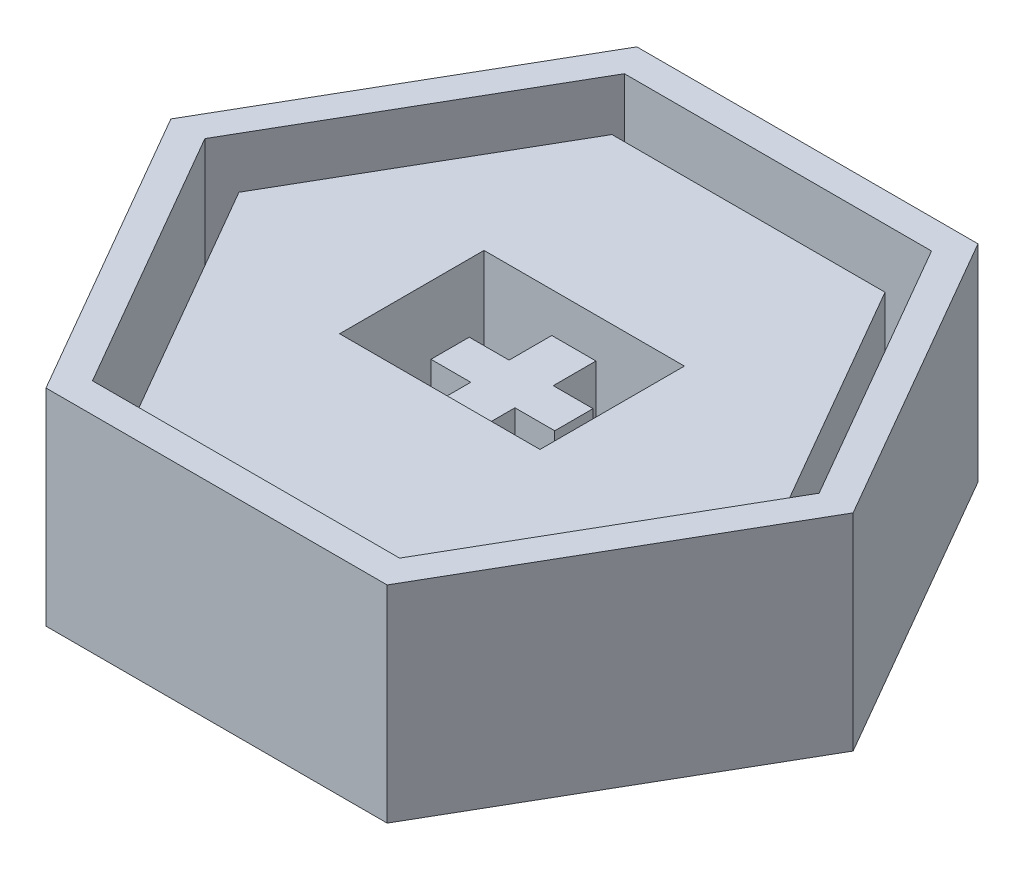
ISO-10303-21;
HEADER;
FILE_DESCRIPTION(('STEP AP214'),'2;1');
FILE_NAME('part.step','',(''),(''),'','','');
FILE_SCHEMA(('AUTOMOTIVE_DESIGN { 1 0 10303 214 1 1 1 1 }'));
ENDSEC;
DATA;
#1=APPLICATION_CONTEXT('core data for automotive mechanical design processes');
#2=APPLICATION_PROTOCOL_DEFINITION('international standard','automotive_design',2000,#1);
#3=PRODUCT_CONTEXT('',#1,'mechanical');
#4=PRODUCT('Part','Part','',(#3));
#5=PRODUCT_RELATED_PRODUCT_CATEGORY('part','',(#4));
#6=PRODUCT_DEFINITION_FORMATION('','',#4);
#7=PRODUCT_DEFINITION_CONTEXT('part definition',#1,'design');
#8=PRODUCT_DEFINITION('design','',#6,#7);
#9=PRODUCT_DEFINITION_SHAPE('','',#8);
#10=(LENGTH_UNIT() NAMED_UNIT(*) SI_UNIT(.MILLI.,.METRE.));
#11=(NAMED_UNIT(*) PLANE_ANGLE_UNIT() SI_UNIT($,.RADIAN.));
#12=(NAMED_UNIT(*) SI_UNIT($,.STERADIAN.) SOLID_ANGLE_UNIT());
#13=UNCERTAINTY_MEASURE_WITH_UNIT(LENGTH_MEASURE(1.E-05),#10,'distance_accuracy_value','');
#14=(GEOMETRIC_REPRESENTATION_CONTEXT(3) GLOBAL_UNCERTAINTY_ASSIGNED_CONTEXT((#13)) GLOBAL_UNIT_ASSIGNED_CONTEXT((#10,
#11,#12)) REPRESENTATION_CONTEXT('',''));
#15=CARTESIAN_POINT('',(0.,0.,0.));
#16=DIRECTION('',(0.,0.,1.));
#17=DIRECTION('',(1.,0.,0.));
#18=AXIS2_PLACEMENT_3D('',#15,#16,#17);
#19=CARTESIAN_POINT('',(0.,1.,0.));
#20=DIRECTION('',(0.,1.,0.));
#21=DIRECTION('',(0.,0.,1.));
#22=AXIS2_PLACEMENT_3D('',#19,#20,#21);
#23=PLANE('',#22);
#24=DIRECTION('',(0.,0.,-1.));
#25=VECTOR('',#24,1.);
#26=CARTESIAN_POINT('',(3.4,1.,2.45));
#27=LINE('',#26,#25);
#28=CARTESIAN_POINT('',(3.4,1.,2.45));
#29=VERTEX_POINT('',#28);
#30=CARTESIAN_POINT('',(3.4,1.,-2.45));
#31=VERTEX_POINT('',#30);
#32=EDGE_CURVE('E408',#29,#31,#27,.T.);
#33=ORIENTED_EDGE('',*,*,#32,.T.);
#34=DIRECTION('',(-1.,0.,0.));
#35=VECTOR('',#34,1.);
#36=CARTESIAN_POINT('',(-3.4,1.,-2.45));
#37=LINE('',#36,#35);
#38=CARTESIAN_POINT('',(-3.4,1.,-2.45));
#39=VERTEX_POINT('',#38);
#40=EDGE_CURVE('E451',#31,#39,#37,.T.);
#41=ORIENTED_EDGE('',*,*,#40,.T.);
#42=DIRECTION('',(0.,0.,1.));
#43=VECTOR('',#42,1.);
#44=CARTESIAN_POINT('',(-3.4,1.,2.45));
#45=LINE('',#44,#43);
#46=CARTESIAN_POINT('',(-3.4,1.,2.45));
#47=VERTEX_POINT('',#46);
#48=EDGE_CURVE('E449',#39,#47,#45,.T.);
#49=ORIENTED_EDGE('',*,*,#48,.T.);
#50=DIRECTION('',(1.,0.,0.));
#51=VECTOR('',#50,1.);
#52=CARTESIAN_POINT('',(-3.4,1.,2.45));
#53=LINE('',#52,#51);
#54=EDGE_CURVE('E446',#47,#29,#53,.T.);
#55=ORIENTED_EDGE('',*,*,#54,.T.);
#56=EDGE_LOOP('',(#33,#41,#49,#55));
#57=FACE_BOUND('',#56,.T.);
#58=DIRECTION('',(0.,0.,-1.));
#59=VECTOR('',#58,1.);
#60=CARTESIAN_POINT('',(0.75,1.,-2.1));
#61=LINE('',#60,#59);
#62=CARTESIAN_POINT('',(0.75,1.,-0.65));
#63=VERTEX_POINT('',#62);
#64=CARTESIAN_POINT('',(0.75,1.,-2.1));
#65=VERTEX_POINT('',#64);
#66=EDGE_CURVE('E273',#63,#65,#61,.T.);
#67=ORIENTED_EDGE('',*,*,#66,.F.);
#68=DIRECTION('',(-1.,0.,0.));
#69=VECTOR('',#68,1.);
#70=CARTESIAN_POINT('',(0.75,1.,-0.65));
#71=LINE('',#70,#69);
#72=CARTESIAN_POINT('',(2.1,1.,-0.65));
#73=VERTEX_POINT('',#72);
#74=EDGE_CURVE('E50',#73,#63,#71,.T.);
#75=ORIENTED_EDGE('',*,*,#74,.F.);
#76=DIRECTION('',(0.,0.,-1.));
#77=VECTOR('',#76,1.);
#78=CARTESIAN_POINT('',(2.1,1.,-0.65));
#79=LINE('',#78,#77);
#80=CARTESIAN_POINT('',(2.1,1.,0.65));
#81=VERTEX_POINT('',#80);
#82=EDGE_CURVE('E306',#81,#73,#79,.T.);
#83=ORIENTED_EDGE('',*,*,#82,.F.);
#84=DIRECTION('',(1.,0.,0.));
#85=VECTOR('',#84,1.);
#86=CARTESIAN_POINT('',(2.1,1.,0.65));
#87=LINE('',#86,#85);
#88=CARTESIAN_POINT('',(0.75,1.,0.65));
#89=VERTEX_POINT('',#88);
#90=EDGE_CURVE('E303',#89,#81,#87,.T.);
#91=ORIENTED_EDGE('',*,*,#90,.F.);
#92=DIRECTION('',(0.,0.,-1.));
#93=VECTOR('',#92,1.);
#94=CARTESIAN_POINT('',(0.75,1.,0.65));
#95=LINE('',#94,#93);
#96=CARTESIAN_POINT('',(0.75,1.,2.1));
#97=VERTEX_POINT('',#96);
#98=EDGE_CURVE('E300',#97,#89,#95,.T.);
#99=ORIENTED_EDGE('',*,*,#98,.F.);
#100=DIRECTION('',(1.,0.,0.));
#101=VECTOR('',#100,1.);
#102=CARTESIAN_POINT('',(0.75,1.,2.1));
#103=LINE('',#102,#101);
#104=CARTESIAN_POINT('',(-0.75,1.,2.1));
#105=VERTEX_POINT('',#104);
#106=EDGE_CURVE('E297',#105,#97,#103,.T.);
#107=ORIENTED_EDGE('',*,*,#106,.F.);
#108=DIRECTION('',(0.,0.,1.));
#109=VECTOR('',#108,1.);
#110=CARTESIAN_POINT('',(-0.75,1.,2.1));
#111=LINE('',#110,#109);
#112=CARTESIAN_POINT('',(-0.75,1.,0.650000000000001));
#113=VERTEX_POINT('',#112);
#114=EDGE_CURVE('E294',#113,#105,#111,.T.);
#115=ORIENTED_EDGE('',*,*,#114,.F.);
#116=DIRECTION('',(1.,0.,0.));
#117=VECTOR('',#116,1.);
#118=CARTESIAN_POINT('',(-0.75,1.,0.650000000000001));
#119=LINE('',#118,#117);
#120=CARTESIAN_POINT('',(-2.1,1.,0.65));
#121=VERTEX_POINT('',#120);
#122=EDGE_CURVE('E291',#121,#113,#119,.T.);
#123=ORIENTED_EDGE('',*,*,#122,.F.);
#124=DIRECTION('',(0.,0.,1.));
#125=VECTOR('',#124,1.);
#126=CARTESIAN_POINT('',(-2.1,1.,0.65));
#127=LINE('',#126,#125);
#128=CARTESIAN_POINT('',(-2.1,1.,-0.65));
#129=VERTEX_POINT('',#128);
#130=EDGE_CURVE('E288',#129,#121,#127,.T.);
#131=ORIENTED_EDGE('',*,*,#130,.F.);
#132=DIRECTION('',(-1.,0.,0.));
#133=VECTOR('',#132,1.);
#134=CARTESIAN_POINT('',(-2.1,1.,-0.65));
#135=LINE('',#134,#133);
#136=CARTESIAN_POINT('',(-0.75,1.,-0.65));
#137=VERTEX_POINT('',#136);
#138=EDGE_CURVE('E282',#137,#129,#135,.T.);
#139=ORIENTED_EDGE('',*,*,#138,.F.);
#140=DIRECTION('',(0.,0.,1.));
#141=VECTOR('',#140,1.);
#142=CARTESIAN_POINT('',(-0.75,1.,-0.65));
#143=LINE('',#142,#141);
#144=CARTESIAN_POINT('',(-0.75,1.,-2.1));
#145=VERTEX_POINT('',#144);
#146=EDGE_CURVE('E280',#145,#137,#143,.T.);
#147=ORIENTED_EDGE('',*,*,#146,.F.);
#148=DIRECTION('',(-1.,0.,0.));
#149=VECTOR('',#148,1.);
#150=CARTESIAN_POINT('',(-0.75,1.,-2.1));
#151=LINE('',#150,#149);
#152=EDGE_CURVE('E264',#65,#145,#151,.T.);
#153=ORIENTED_EDGE('',*,*,#152,.F.);
#154=EDGE_LOOP('',(#67,#75,#83,#91,#99,#107,#115,#123,#131,#139,#147,#153));
#155=FACE_BOUND('',#154,.T.);
#156=ADVANCED_FACE('F35',(#57,#155),#23,.T.);
#157=DIRECTION('',(0.499999999999995,0.,-0.866025403784441));
#158=VECTOR('',#157,1.);
#159=CARTESIAN_POINT('',(5.21058617943648,1.,9.02499999999995));
#160=LINE('',#159,#158);
#161=CARTESIAN_POINT('',(5.21058617943648,1.,9.02499999999995));
#162=VERTEX_POINT('',#161);
#163=CARTESIAN_POINT('',(10.4211723588728,1.,0.));
#164=VERTEX_POINT('',#163);
#165=EDGE_CURVE('E490',#162,#164,#160,.T.);
#166=ORIENTED_EDGE('',*,*,#165,.T.);
#167=DIRECTION('',(-0.500000000000001,0.,-0.866025403784438));
#168=VECTOR('',#167,1.);
#169=CARTESIAN_POINT('',(10.4211723588728,1.,0.));
#170=LINE('',#169,#168);
#171=CARTESIAN_POINT('',(5.21058617943636,1.,-9.02500000000002));
#172=VERTEX_POINT('',#171);
#173=EDGE_CURVE('E494',#164,#172,#170,.T.);
#174=ORIENTED_EDGE('',*,*,#173,.T.);
#175=DIRECTION('',(-1.,0.,0.));
#176=VECTOR('',#175,1.);
#177=CARTESIAN_POINT('',(5.21058617943636,1.,-9.02500000000002));
#178=LINE('',#177,#176);
#179=CARTESIAN_POINT('',(-5.21058617943642,1.,-9.02499999999998));
#180=VERTEX_POINT('',#179);
#181=EDGE_CURVE('E497',#172,#180,#178,.T.);
#182=ORIENTED_EDGE('',*,*,#181,.T.);
#183=DIRECTION('',(-0.499999999999995,0.,0.866025403784441));
#184=VECTOR('',#183,1.);
#185=CARTESIAN_POINT('',(-5.21058617943642,1.,-9.02499999999998));
#186=LINE('',#185,#184);
#187=CARTESIAN_POINT('',(-10.4211723588728,1.,0.));
#188=VERTEX_POINT('',#187);
#189=EDGE_CURVE('E500',#180,#188,#186,.T.);
#190=ORIENTED_EDGE('',*,*,#189,.T.);
#191=DIRECTION('',(0.500000000000007,0.,0.866025403784434));
#192=VECTOR('',#191,1.);
#193=CARTESIAN_POINT('',(-10.4211723588728,1.,0.));
#194=LINE('',#193,#192);
#195=CARTESIAN_POINT('',(-5.21058617943629,1.,9.02500000000006));
#196=VERTEX_POINT('',#195);
#197=EDGE_CURVE('E43',#188,#196,#194,.T.);
#198=ORIENTED_EDGE('',*,*,#197,.T.);
#199=DIRECTION('',(1.,0.,0.));
#200=VECTOR('',#199,1.);
#201=CARTESIAN_POINT('',(-5.21058617943629,1.,9.02500000000006));
#202=LINE('',#201,#200);
#203=EDGE_CURVE('E12',#196,#162,#202,.T.);
#204=ORIENTED_EDGE('',*,*,#203,.T.);
#205=EDGE_LOOP('',(#166,#174,#182,#190,#198,#204));
#206=FACE_BOUND('',#205,.T.);
#207=DIRECTION('',(0.499999999999995,0.,-0.866025403784442));
#208=VECTOR('',#207,1.);
#209=CARTESIAN_POINT('',(4.63323591024685,1.,8.02499999999995));
#210=LINE('',#209,#208);
#211=CARTESIAN_POINT('',(4.63323591024685,1.,8.02499999999995));
#212=VERTEX_POINT('',#211);
#213=CARTESIAN_POINT('',(9.26647182049351,1.,0.));
#214=VERTEX_POINT('',#213);
#215=EDGE_CURVE('E436',#212,#214,#210,.T.);
#216=ORIENTED_EDGE('',*,*,#215,.F.);
#217=DIRECTION('',(1.,0.,0.));
#218=VECTOR('',#217,1.);
#219=CARTESIAN_POINT('',(-4.63323591024668,1.,8.02500000000005));
#220=LINE('',#219,#218);
#221=CARTESIAN_POINT('',(-4.63323591024668,1.,8.02500000000005));
#222=VERTEX_POINT('',#221);
#223=EDGE_CURVE('E441',#222,#212,#220,.T.);
#224=ORIENTED_EDGE('',*,*,#223,.F.);
#225=DIRECTION('',(0.500000000000007,0.,0.866025403784434));
#226=VECTOR('',#225,1.);
#227=CARTESIAN_POINT('',(-9.2664718204935,1.,0.));
#228=LINE('',#227,#226);
#229=CARTESIAN_POINT('',(-9.2664718204935,1.,0.));
#230=VERTEX_POINT('',#229);
#231=EDGE_CURVE('E418',#230,#222,#228,.T.);
#232=ORIENTED_EDGE('',*,*,#231,.F.);
#233=DIRECTION('',(-0.499999999999995,0.,0.866025403784441));
#234=VECTOR('',#233,1.);
#235=CARTESIAN_POINT('',(-4.63323591024679,1.,-8.02499999999999));
#236=LINE('',#235,#234);
#237=CARTESIAN_POINT('',(-4.63323591024679,1.,-8.02499999999999));
#238=VERTEX_POINT('',#237);
#239=EDGE_CURVE('E58',#238,#230,#236,.T.);
#240=ORIENTED_EDGE('',*,*,#239,.F.);
#241=DIRECTION('',(-1.,0.,0.));
#242=VECTOR('',#241,1.);
#243=CARTESIAN_POINT('',(4.63323591024673,1.,-8.02500000000002));
#244=LINE('',#243,#242);
#245=CARTESIAN_POINT('',(4.63323591024673,1.,-8.02500000000002));
#246=VERTEX_POINT('',#245);
#247=EDGE_CURVE('E426',#246,#238,#244,.T.);
#248=ORIENTED_EDGE('',*,*,#247,.F.);
#249=DIRECTION('',(-0.500000000000001,0.,-0.866025403784438));
#250=VECTOR('',#249,1.);
#251=CARTESIAN_POINT('',(9.26647182049351,1.,0.));
#252=LINE('',#251,#250);
#253=EDGE_CURVE('E431',#214,#246,#252,.T.);
#254=ORIENTED_EDGE('',*,*,#253,.F.);
#255=EDGE_LOOP('',(#216,#224,#232,#240,#248,#254));
#256=FACE_BOUND('',#255,.T.);
#257=ADVANCED_FACE('F504',(#206,#256),#23,.T.);
#258=CARTESIAN_POINT('',(-4.63323591024668,31.5167799680138,8.02500000000005));
#259=DIRECTION('',(0.,0.,-1.));
#260=DIRECTION('',(-1.,0.,0.));
#261=AXIS2_PLACEMENT_3D('',#258,#259,#260);
#262=PLANE('',#261);
#263=DIRECTION('',(0.,-1.,0.));
#264=VECTOR('',#263,1.);
#265=CARTESIAN_POINT('',(4.63323591024685,31.5167799680138,8.02499999999995));
#266=LINE('',#265,#264);
#267=CARTESIAN_POINT('',(4.63323591024685,6.,8.02499999999995));
#268=VERTEX_POINT('',#267);
#269=EDGE_CURVE('E440',#268,#212,#266,.T.);
#270=ORIENTED_EDGE('',*,*,#269,.F.);
#271=DIRECTION('',(-1.,0.,0.));
#272=VECTOR('',#271,1.);
#273=CARTESIAN_POINT('',(-4.63323591024668,6.,8.02500000000005));
#274=LINE('',#273,#272);
#275=CARTESIAN_POINT('',(-4.63323591024668,6.,8.02500000000005));
#276=VERTEX_POINT('',#275);
#277=EDGE_CURVE('E448',#268,#276,#274,.T.);
#278=ORIENTED_EDGE('',*,*,#277,.T.);
#279=DIRECTION('',(0.,-1.,0.));
#280=VECTOR('',#279,1.);
#281=CARTESIAN_POINT('',(-4.63323591024668,31.5167799680138,8.02500000000005));
#282=LINE('',#281,#280);
#283=EDGE_CURVE('E445',#276,#222,#282,.T.);
#284=ORIENTED_EDGE('',*,*,#283,.T.);
#285=ORIENTED_EDGE('',*,*,#223,.T.);
#286=EDGE_LOOP('',(#270,#278,#284,#285));
#287=FACE_BOUND('',#286,.T.);
#288=ADVANCED_FACE('F542',(#287),#262,.F.);
#289=CARTESIAN_POINT('',(4.63323591024685,31.5167799680138,8.02499999999995));
#290=DIRECTION('',(-0.866025403784441,0.,-0.499999999999995));
#291=DIRECTION('',(-0.499999999999995,0.,0.866025403784442));
#292=AXIS2_PLACEMENT_3D('',#289,#290,#291);
#293=PLANE('',#292);
#294=DIRECTION('',(0.,-1.,0.));
#295=VECTOR('',#294,1.);
#296=CARTESIAN_POINT('',(9.26647182049351,31.5167799680138,0.));
#297=LINE('',#296,#295);
#298=CARTESIAN_POINT('',(9.26647182049351,6.,0.));
#299=VERTEX_POINT('',#298);
#300=EDGE_CURVE('E435',#299,#214,#297,.T.);
#301=ORIENTED_EDGE('',*,*,#300,.F.);
#302=DIRECTION('',(-0.499999999999995,0.,0.866025403784442));
#303=VECTOR('',#302,1.);
#304=CARTESIAN_POINT('',(4.63323591024685,6.,8.02499999999995));
#305=LINE('',#304,#303);
#306=EDGE_CURVE('E444',#299,#268,#305,.T.);
#307=ORIENTED_EDGE('',*,*,#306,.T.);
#308=ORIENTED_EDGE('',*,*,#269,.T.);
#309=ORIENTED_EDGE('',*,*,#215,.T.);
#310=EDGE_LOOP('',(#301,#307,#308,#309));
#311=FACE_BOUND('',#310,.T.);
#312=ADVANCED_FACE('F568',(#311),#293,.F.);
#313=CARTESIAN_POINT('',(9.26647182049351,31.5167799680138,0.));
#314=DIRECTION('',(-0.866025403784438,0.,0.500000000000001));
#315=DIRECTION('',(0.500000000000001,0.,0.866025403784438));
#316=AXIS2_PLACEMENT_3D('',#313,#314,#315);
#317=PLANE('',#316);
#318=DIRECTION('',(0.,-1.,0.));
#319=VECTOR('',#318,1.);
#320=CARTESIAN_POINT('',(4.63323591024673,31.5167799680138,-8.02500000000002));
#321=LINE('',#320,#319);
#322=CARTESIAN_POINT('',(4.63323591024673,6.,-8.02500000000002));
#323=VERTEX_POINT('',#322);
#324=EDGE_CURVE('E430',#323,#246,#321,.T.);
#325=ORIENTED_EDGE('',*,*,#324,.F.);
#326=DIRECTION('',(0.500000000000001,0.,0.866025403784438));
#327=VECTOR('',#326,1.);
#328=CARTESIAN_POINT('',(9.26647182049351,6.,0.));
#329=LINE('',#328,#327);
#330=EDGE_CURVE('E439',#323,#299,#329,.T.);
#331=ORIENTED_EDGE('',*,*,#330,.T.);
#332=ORIENTED_EDGE('',*,*,#300,.T.);
#333=ORIENTED_EDGE('',*,*,#253,.T.);
#334=EDGE_LOOP('',(#325,#331,#332,#333));
#335=FACE_BOUND('',#334,.T.);
#336=ADVANCED_FACE('F572',(#335),#317,.F.);
#337=CARTESIAN_POINT('',(4.63323591024673,31.5167799680138,-8.02500000000002));
#338=DIRECTION('',(0.,0.,1.));
#339=DIRECTION('',(1.,0.,0.));
#340=AXIS2_PLACEMENT_3D('',#337,#338,#339);
#341=PLANE('',#340);
#342=DIRECTION('',(0.,-1.,0.));
#343=VECTOR('',#342,1.);
#344=CARTESIAN_POINT('',(-4.63323591024679,31.5167799680138,-8.02499999999999));
#345=LINE('',#344,#343);
#346=CARTESIAN_POINT('',(-4.63323591024679,6.,-8.02499999999999));
#347=VERTEX_POINT('',#346);
#348=EDGE_CURVE('E425',#347,#238,#345,.T.);
#349=ORIENTED_EDGE('',*,*,#348,.F.);
#350=DIRECTION('',(1.,0.,0.));
#351=VECTOR('',#350,1.);
#352=CARTESIAN_POINT('',(4.63323591024673,6.,-8.02500000000002));
#353=LINE('',#352,#351);
#354=EDGE_CURVE('E434',#347,#323,#353,.T.);
#355=ORIENTED_EDGE('',*,*,#354,.T.);
#356=ORIENTED_EDGE('',*,*,#324,.T.);
#357=ORIENTED_EDGE('',*,*,#247,.T.);
#358=EDGE_LOOP('',(#349,#355,#356,#357));
#359=FACE_BOUND('',#358,.T.);
#360=ADVANCED_FACE('F576',(#359),#341,.F.);
#361=CARTESIAN_POINT('',(-4.63323591024679,31.5167799680138,-8.02499999999999));
#362=DIRECTION('',(0.866025403784441,0.,0.499999999999995));
#363=DIRECTION('',(0.499999999999995,0.,-0.866025403784442));
#364=AXIS2_PLACEMENT_3D('',#361,#362,#363);
#365=PLANE('',#364);
#366=DIRECTION('',(0.,-1.,0.));
#367=VECTOR('',#366,1.);
#368=CARTESIAN_POINT('',(-9.2664718204935,31.5167799680138,0.));
#369=LINE('',#368,#367);
#370=CARTESIAN_POINT('',(-9.2664718204935,6.,0.));
#371=VERTEX_POINT('',#370);
#372=EDGE_CURVE('E422',#371,#230,#369,.T.);
#373=ORIENTED_EDGE('',*,*,#372,.F.);
#374=DIRECTION('',(0.499999999999995,0.,-0.866025403784442));
#375=VECTOR('',#374,1.);
#376=CARTESIAN_POINT('',(-4.63323591024679,6.,-8.02499999999999));
#377=LINE('',#376,#375);
#378=EDGE_CURVE('E429',#371,#347,#377,.T.);
#379=ORIENTED_EDGE('',*,*,#378,.T.);
#380=ORIENTED_EDGE('',*,*,#348,.T.);
#381=ORIENTED_EDGE('',*,*,#239,.T.);
#382=EDGE_LOOP('',(#373,#379,#380,#381));
#383=FACE_BOUND('',#382,.T.);
#384=ADVANCED_FACE('F580',(#383),#365,.F.);
#385=CARTESIAN_POINT('',(-9.2664718204935,31.5167799680138,0.));
#386=DIRECTION('',(0.866025403784434,0.,-0.500000000000007));
#387=DIRECTION('',(-0.500000000000007,0.,-0.866025403784435));
#388=AXIS2_PLACEMENT_3D('',#385,#386,#387);
#389=PLANE('',#388);
#390=ORIENTED_EDGE('',*,*,#283,.F.);
#391=DIRECTION('',(-0.500000000000007,0.,-0.866025403784435));
#392=VECTOR('',#391,1.);
#393=CARTESIAN_POINT('',(-9.2664718204935,6.,0.));
#394=LINE('',#393,#392);
#395=EDGE_CURVE('E424',#276,#371,#394,.T.);
#396=ORIENTED_EDGE('',*,*,#395,.T.);
#397=ORIENTED_EDGE('',*,*,#372,.T.);
#398=ORIENTED_EDGE('',*,*,#231,.T.);
#399=EDGE_LOOP('',(#390,#396,#397,#398));
#400=FACE_BOUND('',#399,.T.);
#401=ADVANCED_FACE('F554',(#400),#389,.F.);
#402=CARTESIAN_POINT('',(3.4,31.5167799680138,2.45));
#403=DIRECTION('',(-1.,0.,0.));
#404=DIRECTION('',(0.,0.,1.));
#405=AXIS2_PLACEMENT_3D('',#402,#403,#404);
#406=PLANE('',#405);
#407=DIRECTION('',(0.,0.,1.));
#408=VECTOR('',#407,1.);
#409=CARTESIAN_POINT('',(3.4,6.,2.45));
#410=LINE('',#409,#408);
#411=CARTESIAN_POINT('',(3.4,6.,-2.45));
#412=VERTEX_POINT('',#411);
#413=CARTESIAN_POINT('',(3.4,6.,2.45));
#414=VERTEX_POINT('',#413);
#415=EDGE_CURVE('E457',#412,#414,#410,.T.);
#416=ORIENTED_EDGE('',*,*,#415,.F.);
#417=DIRECTION('',(0.,-1.,0.));
#418=VECTOR('',#417,1.);
#419=CARTESIAN_POINT('',(3.4,31.5167799680138,-2.45));
#420=LINE('',#419,#418);
#421=EDGE_CURVE('E421',#412,#31,#420,.T.);
#422=ORIENTED_EDGE('',*,*,#421,.T.);
#423=ORIENTED_EDGE('',*,*,#32,.F.);
#424=DIRECTION('',(0.,-1.,0.));
#425=VECTOR('',#424,1.);
#426=CARTESIAN_POINT('',(3.4,31.5167799680138,2.45));
#427=LINE('',#426,#425);
#428=EDGE_CURVE('E472',#414,#29,#427,.T.);
#429=ORIENTED_EDGE('',*,*,#428,.F.);
#430=EDGE_LOOP('',(#416,#422,#423,#429));
#431=FACE_BOUND('',#430,.T.);
#432=ADVANCED_FACE('F550',(#431),#406,.T.);
#433=CARTESIAN_POINT('',(-3.4,31.5167799680138,-2.45));
#434=DIRECTION('',(0.,0.,1.));
#435=DIRECTION('',(1.,0.,0.));
#436=AXIS2_PLACEMENT_3D('',#433,#434,#435);
#437=PLANE('',#436);
#438=DIRECTION('',(1.,0.,0.));
#439=VECTOR('',#438,1.);
#440=CARTESIAN_POINT('',(-3.4,6.,-2.45));
#441=LINE('',#440,#439);
#442=CARTESIAN_POINT('',(-3.4,6.,-2.45));
#443=VERTEX_POINT('',#442);
#444=EDGE_CURVE('E488',#443,#412,#441,.T.);
#445=ORIENTED_EDGE('',*,*,#444,.F.);
#446=DIRECTION('',(0.,-1.,0.));
#447=VECTOR('',#446,1.);
#448=CARTESIAN_POINT('',(-3.4,31.5167799680138,-2.45));
#449=LINE('',#448,#447);
#450=EDGE_CURVE('E466',#443,#39,#449,.T.);
#451=ORIENTED_EDGE('',*,*,#450,.T.);
#452=ORIENTED_EDGE('',*,*,#40,.F.);
#453=ORIENTED_EDGE('',*,*,#421,.F.);
#454=EDGE_LOOP('',(#445,#451,#452,#453));
#455=FACE_BOUND('',#454,.T.);
#456=ADVANCED_FACE('F553',(#455),#437,.T.);
#457=CARTESIAN_POINT('',(-3.4,31.5167799680138,2.45));
#458=DIRECTION('',(1.,0.,0.));
#459=DIRECTION('',(0.,0.,-1.));
#460=AXIS2_PLACEMENT_3D('',#457,#458,#459);
#461=PLANE('',#460);
#462=DIRECTION('',(0.,0.,-1.));
#463=VECTOR('',#462,1.);
#464=CARTESIAN_POINT('',(-3.4,6.,2.45));
#465=LINE('',#464,#463);
#466=CARTESIAN_POINT('',(-3.4,6.,2.45));
#467=VERTEX_POINT('',#466);
#468=EDGE_CURVE('E456',#467,#443,#465,.T.);
#469=ORIENTED_EDGE('',*,*,#468,.F.);
#470=DIRECTION('',(0.,-1.,0.));
#471=VECTOR('',#470,1.);
#472=CARTESIAN_POINT('',(-3.4,31.5167799680138,2.45));
#473=LINE('',#472,#471);
#474=EDGE_CURVE('E469',#467,#47,#473,.T.);
#475=ORIENTED_EDGE('',*,*,#474,.T.);
#476=ORIENTED_EDGE('',*,*,#48,.F.);
#477=ORIENTED_EDGE('',*,*,#450,.F.);
#478=EDGE_LOOP('',(#469,#475,#476,#477));
#479=FACE_BOUND('',#478,.T.);
#480=ADVANCED_FACE('F558',(#479),#461,.T.);
#481=CARTESIAN_POINT('',(-3.4,31.5167799680138,2.45));
#482=DIRECTION('',(0.,0.,-1.));
#483=DIRECTION('',(-1.,0.,0.));
#484=AXIS2_PLACEMENT_3D('',#481,#482,#483);
#485=PLANE('',#484);
#486=DIRECTION('',(-1.,0.,0.));
#487=VECTOR('',#486,1.);
#488=CARTESIAN_POINT('',(-3.4,6.,2.45));
#489=LINE('',#488,#487);
#490=EDGE_CURVE('E454',#414,#467,#489,.T.);
#491=ORIENTED_EDGE('',*,*,#490,.F.);
#492=ORIENTED_EDGE('',*,*,#428,.T.);
#493=ORIENTED_EDGE('',*,*,#54,.F.);
#494=ORIENTED_EDGE('',*,*,#474,.F.);
#495=EDGE_LOOP('',(#491,#492,#493,#494));
#496=FACE_BOUND('',#495,.T.);
#497=ADVANCED_FACE('F548',(#496),#485,.T.);
#498=CARTESIAN_POINT('',(0.,6.,0.));
#499=DIRECTION('',(0.,-1.,0.));
#500=DIRECTION('',(0.,0.,-1.));
#501=AXIS2_PLACEMENT_3D('',#498,#499,#500);
#502=PLANE('',#501);
#503=ORIENTED_EDGE('',*,*,#415,.T.);
#504=ORIENTED_EDGE('',*,*,#490,.T.);
#505=ORIENTED_EDGE('',*,*,#468,.T.);
#506=ORIENTED_EDGE('',*,*,#444,.T.);
#507=EDGE_LOOP('',(#503,#504,#505,#506));
#508=FACE_BOUND('',#507,.T.);
#509=ORIENTED_EDGE('',*,*,#306,.F.);
#510=ORIENTED_EDGE('',*,*,#330,.F.);
#511=ORIENTED_EDGE('',*,*,#354,.F.);
#512=ORIENTED_EDGE('',*,*,#378,.F.);
#513=ORIENTED_EDGE('',*,*,#395,.F.);
#514=ORIENTED_EDGE('',*,*,#277,.F.);
#515=EDGE_LOOP('',(#509,#510,#511,#512,#513,#514));
#516=FACE_BOUND('',#515,.T.);
#517=ADVANCED_FACE('F544',(#508,#516),#502,.F.);
#518=CARTESIAN_POINT('',(5.787936448626,7.,-10.025));
#519=DIRECTION('',(0.866025403784438,0.,-0.500000000000001));
#520=DIRECTION('',(-0.500000000000001,0.,-0.866025403784438));
#521=AXIS2_PLACEMENT_3D('',#518,#519,#520);
#522=PLANE('',#521);
#523=DIRECTION('',(0.500000000000001,0.,0.866025403784438));
#524=VECTOR('',#523,1.);
#525=CARTESIAN_POINT('',(5.787936448626,0.,-10.025));
#526=LINE('',#525,#524);
#527=CARTESIAN_POINT('',(5.787936448626,0.,-10.025));
#528=VERTEX_POINT('',#527);
#529=CARTESIAN_POINT('',(11.575872897252,0.,0.));
#530=VERTEX_POINT('',#529);
#531=EDGE_CURVE('E356',#528,#530,#526,.T.);
#532=ORIENTED_EDGE('',*,*,#531,.F.);
#533=DIRECTION('',(0.,-1.,0.));
#534=VECTOR('',#533,1.);
#535=CARTESIAN_POINT('',(5.787936448626,7.,-10.025));
#536=LINE('',#535,#534);
#537=CARTESIAN_POINT('',(5.787936448626,7.,-10.025));
#538=VERTEX_POINT('',#537);
#539=EDGE_CURVE('E406',#538,#528,#536,.T.);
#540=ORIENTED_EDGE('',*,*,#539,.F.);
#541=DIRECTION('',(0.500000000000001,0.,0.866025403784438));
#542=VECTOR('',#541,1.);
#543=CARTESIAN_POINT('',(5.787936448626,7.,-10.025));
#544=LINE('',#543,#542);
#545=CARTESIAN_POINT('',(11.575872897252,7.,0.));
#546=VERTEX_POINT('',#545);
#547=EDGE_CURVE('E370',#538,#546,#544,.T.);
#548=ORIENTED_EDGE('',*,*,#547,.T.);
#549=DIRECTION('',(0.,-1.,0.));
#550=VECTOR('',#549,1.);
#551=CARTESIAN_POINT('',(11.575872897252,7.,0.));
#552=LINE('',#551,#550);
#553=EDGE_CURVE('E389',#546,#530,#552,.T.);
#554=ORIENTED_EDGE('',*,*,#553,.T.);
#555=EDGE_LOOP('',(#532,#540,#548,#554));
#556=FACE_BOUND('',#555,.T.);
#557=ADVANCED_FACE('F547',(#556),#522,.T.);
#558=CARTESIAN_POINT('',(-5.78793644862605,7.,-10.025));
#559=DIRECTION('',(0.,0.,-1.));
#560=DIRECTION('',(-1.,0.,0.));
#561=AXIS2_PLACEMENT_3D('',#558,#559,#560);
#562=PLANE('',#561);
#563=DIRECTION('',(1.,0.,0.));
#564=VECTOR('',#563,1.);
#565=CARTESIAN_POINT('',(-5.78793644862605,0.,-10.025));
#566=LINE('',#565,#564);
#567=CARTESIAN_POINT('',(-5.78793644862605,0.,-10.025));
#568=VERTEX_POINT('',#567);
#569=EDGE_CURVE('E374',#568,#528,#566,.T.);
#570=ORIENTED_EDGE('',*,*,#569,.F.);
#571=DIRECTION('',(0.,-1.,0.));
#572=VECTOR('',#571,1.);
#573=CARTESIAN_POINT('',(-5.78793644862605,7.,-10.025));
#574=LINE('',#573,#572);
#575=CARTESIAN_POINT('',(-5.78793644862605,7.,-10.025));
#576=VERTEX_POINT('',#575);
#577=EDGE_CURVE('E409',#576,#568,#574,.T.);
#578=ORIENTED_EDGE('',*,*,#577,.F.);
#579=DIRECTION('',(1.,0.,0.));
#580=VECTOR('',#579,1.);
#581=CARTESIAN_POINT('',(-5.78793644862605,7.,-10.025));
#582=LINE('',#581,#580);
#583=EDGE_CURVE('E386',#576,#538,#582,.T.);
#584=ORIENTED_EDGE('',*,*,#583,.T.);
#585=ORIENTED_EDGE('',*,*,#539,.T.);
#586=EDGE_LOOP('',(#570,#578,#584,#585));
#587=FACE_BOUND('',#586,.T.);
#588=ADVANCED_FACE('F589',(#587),#562,.T.);
#589=CARTESIAN_POINT('',(-11.575872897252,7.,0.));
#590=DIRECTION('',(-0.866025403784441,0.,-0.499999999999995));
#591=DIRECTION('',(-0.499999999999995,0.,0.866025403784442));
#592=AXIS2_PLACEMENT_3D('',#589,#590,#591);
#593=PLANE('',#592);
#594=DIRECTION('',(0.499999999999995,0.,-0.866025403784441));
#595=VECTOR('',#594,1.);
#596=CARTESIAN_POINT('',(-11.575872897252,0.,0.));
#597=LINE('',#596,#595);
#598=CARTESIAN_POINT('',(-11.575872897252,0.,0.));
#599=VERTEX_POINT('',#598);
#600=EDGE_CURVE('E401',#599,#568,#597,.T.);
#601=ORIENTED_EDGE('',*,*,#600,.F.);
#602=DIRECTION('',(0.,-1.,0.));
#603=VECTOR('',#602,1.);
#604=CARTESIAN_POINT('',(-11.575872897252,7.,0.));
#605=LINE('',#604,#603);
#606=CARTESIAN_POINT('',(-11.575872897252,7.,0.));
#607=VERTEX_POINT('',#606);
#608=EDGE_CURVE('E411',#607,#599,#605,.T.);
#609=ORIENTED_EDGE('',*,*,#608,.F.);
#610=DIRECTION('',(0.499999999999995,0.,-0.866025403784441));
#611=VECTOR('',#610,1.);
#612=CARTESIAN_POINT('',(-11.575872897252,7.,0.));
#613=LINE('',#612,#611);
#614=EDGE_CURVE('E383',#607,#576,#613,.T.);
#615=ORIENTED_EDGE('',*,*,#614,.T.);
#616=ORIENTED_EDGE('',*,*,#577,.T.);
#617=EDGE_LOOP('',(#601,#609,#615,#616));
#618=FACE_BOUND('',#617,.T.);
#619=ADVANCED_FACE('F602',(#618),#593,.T.);
#620=CARTESIAN_POINT('',(-5.78793644862598,7.,10.0249999999999));
#621=DIRECTION('',(-0.866025403784434,0.,0.500000000000007));
#622=DIRECTION('',(0.500000000000007,0.,0.866025403784435));
#623=AXIS2_PLACEMENT_3D('',#620,#621,#622);
#624=PLANE('',#623);
#625=DIRECTION('',(-0.500000000000007,0.,-0.866025403784434));
#626=VECTOR('',#625,1.);
#627=CARTESIAN_POINT('',(-5.78793644862598,0.,10.0249999999999));
#628=LINE('',#627,#626);
#629=CARTESIAN_POINT('',(-5.78793644862598,0.,10.0249999999999));
#630=VERTEX_POINT('',#629);
#631=EDGE_CURVE('E398',#630,#599,#628,.T.);
#632=ORIENTED_EDGE('',*,*,#631,.F.);
#633=DIRECTION('',(0.,-1.,0.));
#634=VECTOR('',#633,1.);
#635=CARTESIAN_POINT('',(-5.78793644862598,7.,10.0249999999999));
#636=LINE('',#635,#634);
#637=CARTESIAN_POINT('',(-5.78793644862598,7.,10.0249999999999));
#638=VERTEX_POINT('',#637);
#639=EDGE_CURVE('E413',#638,#630,#636,.T.);
#640=ORIENTED_EDGE('',*,*,#639,.F.);
#641=DIRECTION('',(-0.500000000000007,0.,-0.866025403784434));
#642=VECTOR('',#641,1.);
#643=CARTESIAN_POINT('',(-5.78793644862598,7.,10.0249999999999));
#644=LINE('',#643,#642);
#645=EDGE_CURVE('E380',#638,#607,#644,.T.);
#646=ORIENTED_EDGE('',*,*,#645,.T.);
#647=ORIENTED_EDGE('',*,*,#608,.T.);
#648=EDGE_LOOP('',(#632,#640,#646,#647));
#649=FACE_BOUND('',#648,.T.);
#650=ADVANCED_FACE('F598',(#649),#624,.T.);
#651=CARTESIAN_POINT('',(5.78793644862611,7.,10.0249999999999));
#652=DIRECTION('',(0.,0.,1.));
#653=DIRECTION('',(1.,0.,0.));
#654=AXIS2_PLACEMENT_3D('',#651,#652,#653);
#655=PLANE('',#654);
#656=DIRECTION('',(-1.,0.,0.));
#657=VECTOR('',#656,1.);
#658=CARTESIAN_POINT('',(5.78793644862611,0.,10.0249999999999));
#659=LINE('',#658,#657);
#660=CARTESIAN_POINT('',(5.78793644862611,0.,10.0249999999999));
#661=VERTEX_POINT('',#660);
#662=EDGE_CURVE('E395',#661,#630,#659,.T.);
#663=ORIENTED_EDGE('',*,*,#662,.F.);
#664=DIRECTION('',(0.,-1.,0.));
#665=VECTOR('',#664,1.);
#666=CARTESIAN_POINT('',(5.78793644862611,7.,10.0249999999999));
#667=LINE('',#666,#665);
#668=CARTESIAN_POINT('',(5.78793644862611,7.,10.0249999999999));
#669=VERTEX_POINT('',#668);
#670=EDGE_CURVE('E415',#669,#661,#667,.T.);
#671=ORIENTED_EDGE('',*,*,#670,.F.);
#672=DIRECTION('',(-1.,0.,0.));
#673=VECTOR('',#672,1.);
#674=CARTESIAN_POINT('',(5.78793644862611,7.,10.0249999999999));
#675=LINE('',#674,#673);
#676=EDGE_CURVE('E377',#669,#638,#675,.T.);
#677=ORIENTED_EDGE('',*,*,#676,.T.);
#678=ORIENTED_EDGE('',*,*,#639,.T.);
#679=EDGE_LOOP('',(#663,#671,#677,#678));
#680=FACE_BOUND('',#679,.T.);
#681=ADVANCED_FACE('F594',(#680),#655,.T.);
#682=CARTESIAN_POINT('',(11.575872897252,7.,0.));
#683=DIRECTION('',(0.866025403784442,0.,0.499999999999995));
#684=DIRECTION('',(0.499999999999995,0.,-0.866025403784442));
#685=AXIS2_PLACEMENT_3D('',#682,#683,#684);
#686=PLANE('',#685);
#687=DIRECTION('',(-0.499999999999995,0.,0.866025403784442));
#688=VECTOR('',#687,1.);
#689=CARTESIAN_POINT('',(11.575872897252,0.,0.));
#690=LINE('',#689,#688);
#691=EDGE_CURVE('E392',#530,#661,#690,.T.);
#692=ORIENTED_EDGE('',*,*,#691,.F.);
#693=ORIENTED_EDGE('',*,*,#553,.F.);
#694=DIRECTION('',(-0.499999999999995,0.,0.866025403784442));
#695=VECTOR('',#694,1.);
#696=CARTESIAN_POINT('',(11.575872897252,7.,0.));
#697=LINE('',#696,#695);
#698=EDGE_CURVE('E373',#546,#669,#697,.T.);
#699=ORIENTED_EDGE('',*,*,#698,.T.);
#700=ORIENTED_EDGE('',*,*,#670,.T.);
#701=EDGE_LOOP('',(#692,#693,#699,#700));
#702=FACE_BOUND('',#701,.T.);
#703=ADVANCED_FACE('F591',(#702),#686,.T.);
#704=CARTESIAN_POINT('',(0.,7.,0.));
#705=DIRECTION('',(0.,-1.,0.));
#706=DIRECTION('',(0.,0.,-1.));
#707=AXIS2_PLACEMENT_3D('',#704,#705,#706);
#708=PLANE('',#707);
#709=DIRECTION('',(1.,0.,0.));
#710=VECTOR('',#709,1.);
#711=CARTESIAN_POINT('',(-5.21058617943642,7.,-9.02499999999998));
#712=LINE('',#711,#710);
#713=CARTESIAN_POINT('',(-5.21058617943642,7.,-9.02499999999998));
#714=VERTEX_POINT('',#713);
#715=CARTESIAN_POINT('',(5.21058617943636,7.,-9.02500000000002));
#716=VERTEX_POINT('',#715);
#717=EDGE_CURVE('E349',#714,#716,#712,.T.);
#718=ORIENTED_EDGE('',*,*,#717,.T.);
#719=DIRECTION('',(0.500000000000001,0.,0.866025403784438));
#720=VECTOR('',#719,1.);
#721=CARTESIAN_POINT('',(5.21058617943636,7.,-9.02500000000002));
#722=LINE('',#721,#720);
#723=CARTESIAN_POINT('',(10.4211723588728,7.,0.));
#724=VERTEX_POINT('',#723);
#725=EDGE_CURVE('E333',#716,#724,#722,.T.);
#726=ORIENTED_EDGE('',*,*,#725,.T.);
#727=DIRECTION('',(-0.499999999999995,0.,0.866025403784441));
#728=VECTOR('',#727,1.);
#729=CARTESIAN_POINT('',(10.4211723588728,7.,0.));
#730=LINE('',#729,#728);
#731=CARTESIAN_POINT('',(5.21058617943648,7.,9.02499999999995));
#732=VERTEX_POINT('',#731);
#733=EDGE_CURVE('E336',#724,#732,#730,.T.);
#734=ORIENTED_EDGE('',*,*,#733,.T.);
#735=DIRECTION('',(-1.,0.,0.));
#736=VECTOR('',#735,1.);
#737=CARTESIAN_POINT('',(5.21058617943648,7.,9.02499999999995));
#738=LINE('',#737,#736);
#739=CARTESIAN_POINT('',(-5.21058617943629,7.,9.02500000000006));
#740=VERTEX_POINT('',#739);
#741=EDGE_CURVE('E340',#732,#740,#738,.T.);
#742=ORIENTED_EDGE('',*,*,#741,.T.);
#743=DIRECTION('',(-0.500000000000007,0.,-0.866025403784434));
#744=VECTOR('',#743,1.);
#745=CARTESIAN_POINT('',(-5.21058617943629,7.,9.02500000000006));
#746=LINE('',#745,#744);
#747=CARTESIAN_POINT('',(-10.4211723588728,7.,0.));
#748=VERTEX_POINT('',#747);
#749=EDGE_CURVE('E343',#740,#748,#746,.T.);
#750=ORIENTED_EDGE('',*,*,#749,.T.);
#751=DIRECTION('',(0.499999999999995,0.,-0.866025403784441));
#752=VECTOR('',#751,1.);
#753=CARTESIAN_POINT('',(-10.4211723588728,7.,0.));
#754=LINE('',#753,#752);
#755=EDGE_CURVE('E346',#748,#714,#754,.T.);
#756=ORIENTED_EDGE('',*,*,#755,.T.);
#757=EDGE_LOOP('',(#718,#726,#734,#742,#750,#756));
#758=FACE_BOUND('',#757,.T.);
#759=ORIENTED_EDGE('',*,*,#547,.F.);
#760=ORIENTED_EDGE('',*,*,#583,.F.);
#761=ORIENTED_EDGE('',*,*,#614,.F.);
#762=ORIENTED_EDGE('',*,*,#645,.F.);
#763=ORIENTED_EDGE('',*,*,#676,.F.);
#764=ORIENTED_EDGE('',*,*,#698,.F.);
#765=EDGE_LOOP('',(#759,#760,#761,#762,#763,#764));
#766=FACE_BOUND('',#765,.T.);
#767=ADVANCED_FACE('F514',(#758,#766),#708,.F.);
#768=CARTESIAN_POINT('',(5.21058617943636,7.,-9.02500000000002));
#769=DIRECTION('',(0.866025403784438,0.,-0.500000000000001));
#770=DIRECTION('',(-0.500000000000001,0.,-0.866025403784438));
#771=AXIS2_PLACEMENT_3D('',#768,#769,#770);
#772=PLANE('',#771);
#773=ORIENTED_EDGE('',*,*,#173,.F.);
#774=DIRECTION('',(0.,-1.,0.));
#775=VECTOR('',#774,1.);
#776=CARTESIAN_POINT('',(10.4211723588728,7.,0.));
#777=LINE('',#776,#775);
#778=EDGE_CURVE('E352',#724,#164,#777,.T.);
#779=ORIENTED_EDGE('',*,*,#778,.F.);
#780=ORIENTED_EDGE('',*,*,#725,.F.);
#781=DIRECTION('',(0.,-1.,0.));
#782=VECTOR('',#781,1.);
#783=CARTESIAN_POINT('',(5.21058617943636,7.,-9.02500000000002));
#784=LINE('',#783,#782);
#785=EDGE_CURVE('E353',#716,#172,#784,.T.);
#786=ORIENTED_EDGE('',*,*,#785,.T.);
#787=EDGE_LOOP('',(#773,#779,#780,#786));
#788=FACE_BOUND('',#787,.T.);
#789=ADVANCED_FACE('F524',(#788),#772,.F.);
#790=CARTESIAN_POINT('',(-5.21058617943642,7.,-9.02499999999998));
#791=DIRECTION('',(0.,0.,-1.));
#792=DIRECTION('',(-1.,0.,0.));
#793=AXIS2_PLACEMENT_3D('',#790,#791,#792);
#794=PLANE('',#793);
#795=ORIENTED_EDGE('',*,*,#181,.F.);
#796=ORIENTED_EDGE('',*,*,#785,.F.);
#797=ORIENTED_EDGE('',*,*,#717,.F.);
#798=DIRECTION('',(0.,-1.,0.));
#799=VECTOR('',#798,1.);
#800=CARTESIAN_POINT('',(-5.21058617943642,7.,-9.02499999999998));
#801=LINE('',#800,#799);
#802=EDGE_CURVE('E357',#714,#180,#801,.T.);
#803=ORIENTED_EDGE('',*,*,#802,.T.);
#804=EDGE_LOOP('',(#795,#796,#797,#803));
#805=FACE_BOUND('',#804,.T.);
#806=ADVANCED_FACE('F527',(#805),#794,.F.);
#807=CARTESIAN_POINT('',(-10.4211723588728,7.,0.));
#808=DIRECTION('',(-0.866025403784441,0.,-0.499999999999995));
#809=DIRECTION('',(-0.499999999999995,0.,0.866025403784442));
#810=AXIS2_PLACEMENT_3D('',#807,#808,#809);
#811=PLANE('',#810);
#812=ORIENTED_EDGE('',*,*,#189,.F.);
#813=ORIENTED_EDGE('',*,*,#802,.F.);
#814=ORIENTED_EDGE('',*,*,#755,.F.);
#815=DIRECTION('',(0.,-1.,0.));
#816=VECTOR('',#815,1.);
#817=CARTESIAN_POINT('',(-10.4211723588728,7.,0.));
#818=LINE('',#817,#816);
#819=EDGE_CURVE('E360',#748,#188,#818,.T.);
#820=ORIENTED_EDGE('',*,*,#819,.T.);
#821=EDGE_LOOP('',(#812,#813,#814,#820));
#822=FACE_BOUND('',#821,.T.);
#823=ADVANCED_FACE('F511',(#822),#811,.F.);
#824=CARTESIAN_POINT('',(-5.21058617943629,7.,9.02500000000006));
#825=DIRECTION('',(-0.866025403784434,0.,0.500000000000007));
#826=DIRECTION('',(0.500000000000007,0.,0.866025403784435));
#827=AXIS2_PLACEMENT_3D('',#824,#825,#826);
#828=PLANE('',#827);
#829=ORIENTED_EDGE('',*,*,#197,.F.);
#830=ORIENTED_EDGE('',*,*,#819,.F.);
#831=ORIENTED_EDGE('',*,*,#749,.F.);
#832=DIRECTION('',(0.,-1.,0.));
#833=VECTOR('',#832,1.);
#834=CARTESIAN_POINT('',(-5.21058617943629,7.,9.02500000000006));
#835=LINE('',#834,#833);
#836=EDGE_CURVE('E363',#740,#196,#835,.T.);
#837=ORIENTED_EDGE('',*,*,#836,.T.);
#838=EDGE_LOOP('',(#829,#830,#831,#837));
#839=FACE_BOUND('',#838,.T.);
#840=ADVANCED_FACE('F507',(#839),#828,.F.);
#841=CARTESIAN_POINT('',(5.21058617943648,7.,9.02499999999995));
#842=DIRECTION('',(0.,0.,1.));
#843=DIRECTION('',(1.,0.,0.));
#844=AXIS2_PLACEMENT_3D('',#841,#842,#843);
#845=PLANE('',#844);
#846=ORIENTED_EDGE('',*,*,#203,.F.);
#847=ORIENTED_EDGE('',*,*,#836,.F.);
#848=ORIENTED_EDGE('',*,*,#741,.F.);
#849=DIRECTION('',(0.,-1.,0.));
#850=VECTOR('',#849,1.);
#851=CARTESIAN_POINT('',(5.21058617943648,7.,9.02499999999995));
#852=LINE('',#851,#850);
#853=EDGE_CURVE('E366',#732,#162,#852,.T.);
#854=ORIENTED_EDGE('',*,*,#853,.T.);
#855=EDGE_LOOP('',(#846,#847,#848,#854));
#856=FACE_BOUND('',#855,.T.);
#857=ADVANCED_FACE('F519',(#856),#845,.F.);
#858=CARTESIAN_POINT('',(10.4211723588728,7.,0.));
#859=DIRECTION('',(0.866025403784441,0.,0.499999999999995));
#860=DIRECTION('',(0.499999999999995,0.,-0.866025403784442));
#861=AXIS2_PLACEMENT_3D('',#858,#859,#860);
#862=PLANE('',#861);
#863=ORIENTED_EDGE('',*,*,#165,.F.);
#864=ORIENTED_EDGE('',*,*,#853,.F.);
#865=ORIENTED_EDGE('',*,*,#733,.F.);
#866=ORIENTED_EDGE('',*,*,#778,.T.);
#867=EDGE_LOOP('',(#863,#864,#865,#866));
#868=FACE_BOUND('',#867,.T.);
#869=ADVANCED_FACE('F521',(#868),#862,.F.);
#870=CARTESIAN_POINT('',(0.,0.,0.));
#871=DIRECTION('',(0.,1.,0.));
#872=DIRECTION('',(0.,0.,1.));
#873=AXIS2_PLACEMENT_3D('',#870,#871,#872);
#874=PLANE('',#873);
#875=ORIENTED_EDGE('',*,*,#531,.T.);
#876=ORIENTED_EDGE('',*,*,#691,.T.);
#877=ORIENTED_EDGE('',*,*,#662,.T.);
#878=ORIENTED_EDGE('',*,*,#631,.T.);
#879=ORIENTED_EDGE('',*,*,#600,.T.);
#880=ORIENTED_EDGE('',*,*,#569,.T.);
#881=EDGE_LOOP('',(#875,#876,#877,#878,#879,#880));
#882=FACE_BOUND('',#881,.T.);
#883=ADVANCED_FACE('F37',(#882),#874,.F.);
#884=CARTESIAN_POINT('',(0.75,11.939696961967,-0.65));
#885=DIRECTION('',(0.,0.,1.));
#886=DIRECTION('',(1.,0.,0.));
#887=AXIS2_PLACEMENT_3D('',#884,#885,#886);
#888=PLANE('',#887);
#889=DIRECTION('',(0.,-1.,0.));
#890=VECTOR('',#889,1.);
#891=CARTESIAN_POINT('',(0.75,11.939696961967,-0.65));
#892=LINE('',#891,#890);
#893=CARTESIAN_POINT('',(0.75,5.,-0.65));
#894=VERTEX_POINT('',#893);
#895=EDGE_CURVE('E275',#894,#63,#892,.T.);
#896=ORIENTED_EDGE('',*,*,#895,.F.);
#897=DIRECTION('',(1.,0.,0.));
#898=VECTOR('',#897,1.);
#899=CARTESIAN_POINT('',(0.75,5.,-0.65));
#900=LINE('',#899,#898);
#901=CARTESIAN_POINT('',(2.1,5.,-0.65));
#902=VERTEX_POINT('',#901);
#903=EDGE_CURVE('E269',#894,#902,#900,.T.);
#904=ORIENTED_EDGE('',*,*,#903,.T.);
#905=DIRECTION('',(0.,-1.,0.));
#906=VECTOR('',#905,1.);
#907=CARTESIAN_POINT('',(2.1,11.939696961967,-0.65));
#908=LINE('',#907,#906);
#909=EDGE_CURVE('E311',#902,#73,#908,.T.);
#910=ORIENTED_EDGE('',*,*,#909,.T.);
#911=ORIENTED_EDGE('',*,*,#74,.T.);
#912=EDGE_LOOP('',(#896,#904,#910,#911));
#913=FACE_BOUND('',#912,.T.);
#914=ADVANCED_FACE('F635',(#913),#888,.F.);
#915=CARTESIAN_POINT('',(2.1,11.939696961967,-0.65));
#916=DIRECTION('',(-1.,0.,0.));
#917=DIRECTION('',(0.,0.,1.));
#918=AXIS2_PLACEMENT_3D('',#915,#916,#917);
#919=PLANE('',#918);
#920=ORIENTED_EDGE('',*,*,#909,.F.);
#921=DIRECTION('',(0.,0.,1.));
#922=VECTOR('',#921,1.);
#923=CARTESIAN_POINT('',(2.1,5.,-0.65));
#924=LINE('',#923,#922);
#925=CARTESIAN_POINT('',(2.1,5.,0.65));
#926=VERTEX_POINT('',#925);
#927=EDGE_CURVE('E332',#902,#926,#924,.T.);
#928=ORIENTED_EDGE('',*,*,#927,.T.);
#929=DIRECTION('',(0.,-1.,0.));
#930=VECTOR('',#929,1.);
#931=CARTESIAN_POINT('',(2.1,11.939696961967,0.65));
#932=LINE('',#931,#930);
#933=EDGE_CURVE('E313',#926,#81,#932,.T.);
#934=ORIENTED_EDGE('',*,*,#933,.T.);
#935=ORIENTED_EDGE('',*,*,#82,.T.);
#936=EDGE_LOOP('',(#920,#928,#934,#935));
#937=FACE_BOUND('',#936,.T.);
#938=ADVANCED_FACE('F642',(#937),#919,.F.);
#939=CARTESIAN_POINT('',(2.1,11.939696961967,0.65));
#940=DIRECTION('',(0.,0.,-1.));
#941=DIRECTION('',(-1.,0.,0.));
#942=AXIS2_PLACEMENT_3D('',#939,#940,#941);
#943=PLANE('',#942);
#944=ORIENTED_EDGE('',*,*,#933,.F.);
#945=DIRECTION('',(-1.,0.,0.));
#946=VECTOR('',#945,1.);
#947=CARTESIAN_POINT('',(2.1,5.,0.65));
#948=LINE('',#947,#946);
#949=CARTESIAN_POINT('',(0.75,5.,0.65));
#950=VERTEX_POINT('',#949);
#951=EDGE_CURVE('E917',#926,#950,#948,.T.);
#952=ORIENTED_EDGE('',*,*,#951,.T.);
#953=DIRECTION('',(0.,-1.,0.));
#954=VECTOR('',#953,1.);
#955=CARTESIAN_POINT('',(0.75,11.939696961967,0.65));
#956=LINE('',#955,#954);
#957=EDGE_CURVE('E315',#950,#89,#956,.T.);
#958=ORIENTED_EDGE('',*,*,#957,.T.);
#959=ORIENTED_EDGE('',*,*,#90,.T.);
#960=EDGE_LOOP('',(#944,#952,#958,#959));
#961=FACE_BOUND('',#960,.T.);
#962=ADVANCED_FACE('F649',(#961),#943,.F.);
#963=CARTESIAN_POINT('',(0.75,11.939696961967,0.65));
#964=DIRECTION('',(-1.,0.,0.));
#965=DIRECTION('',(0.,0.,1.));
#966=AXIS2_PLACEMENT_3D('',#963,#964,#965);
#967=PLANE('',#966);
#968=ORIENTED_EDGE('',*,*,#957,.F.);
#969=DIRECTION('',(0.,0.,1.));
#970=VECTOR('',#969,1.);
#971=CARTESIAN_POINT('',(0.75,5.,0.65));
#972=LINE('',#971,#970);
#973=CARTESIAN_POINT('',(0.75,5.,2.1));
#974=VERTEX_POINT('',#973);
#975=EDGE_CURVE('E927',#950,#974,#972,.T.);
#976=ORIENTED_EDGE('',*,*,#975,.T.);
#977=DIRECTION('',(0.,-1.,0.));
#978=VECTOR('',#977,1.);
#979=CARTESIAN_POINT('',(0.75,11.939696961967,2.1));
#980=LINE('',#979,#978);
#981=EDGE_CURVE('E317',#974,#97,#980,.T.);
#982=ORIENTED_EDGE('',*,*,#981,.T.);
#983=ORIENTED_EDGE('',*,*,#98,.T.);
#984=EDGE_LOOP('',(#968,#976,#982,#983));
#985=FACE_BOUND('',#984,.T.);
#986=ADVANCED_FACE('F657',(#985),#967,.F.);
#987=CARTESIAN_POINT('',(0.75,11.939696961967,2.1));
#988=DIRECTION('',(0.,0.,-1.));
#989=DIRECTION('',(-1.,0.,0.));
#990=AXIS2_PLACEMENT_3D('',#987,#988,#989);
#991=PLANE('',#990);
#992=ORIENTED_EDGE('',*,*,#981,.F.);
#993=DIRECTION('',(-1.,0.,0.));
#994=VECTOR('',#993,1.);
#995=CARTESIAN_POINT('',(0.75,5.,2.1));
#996=LINE('',#995,#994);
#997=CARTESIAN_POINT('',(-0.75,5.,2.1));
#998=VERTEX_POINT('',#997);
#999=EDGE_CURVE('E944',#974,#998,#996,.T.);
#1000=ORIENTED_EDGE('',*,*,#999,.T.);
#1001=DIRECTION('',(0.,-1.,0.));
#1002=VECTOR('',#1001,1.);
#1003=CARTESIAN_POINT('',(-0.75,11.939696961967,2.1));
#1004=LINE('',#1003,#1002);
#1005=EDGE_CURVE('E319',#998,#105,#1004,.T.);
#1006=ORIENTED_EDGE('',*,*,#1005,.T.);
#1007=ORIENTED_EDGE('',*,*,#106,.T.);
#1008=EDGE_LOOP('',(#992,#1000,#1006,#1007));
#1009=FACE_BOUND('',#1008,.T.);
#1010=ADVANCED_FACE('F665',(#1009),#991,.F.);
#1011=CARTESIAN_POINT('',(-0.75,11.939696961967,2.1));
#1012=DIRECTION('',(1.,0.,0.));
#1013=DIRECTION('',(0.,0.,-1.));
#1014=AXIS2_PLACEMENT_3D('',#1011,#1012,#1013);
#1015=PLANE('',#1014);
#1016=ORIENTED_EDGE('',*,*,#1005,.F.);
#1017=DIRECTION('',(0.,0.,-1.));
#1018=VECTOR('',#1017,1.);
#1019=CARTESIAN_POINT('',(-0.75,5.,2.1));
#1020=LINE('',#1019,#1018);
#1021=CARTESIAN_POINT('',(-0.75,5.,0.650000000000001));
#1022=VERTEX_POINT('',#1021);
#1023=EDGE_CURVE('E935',#998,#1022,#1020,.T.);
#1024=ORIENTED_EDGE('',*,*,#1023,.T.);
#1025=DIRECTION('',(0.,-1.,0.));
#1026=VECTOR('',#1025,1.);
#1027=CARTESIAN_POINT('',(-0.75,11.939696961967,0.650000000000001));
#1028=LINE('',#1027,#1026);
#1029=EDGE_CURVE('E321',#1022,#113,#1028,.T.);
#1030=ORIENTED_EDGE('',*,*,#1029,.T.);
#1031=ORIENTED_EDGE('',*,*,#114,.T.);
#1032=EDGE_LOOP('',(#1016,#1024,#1030,#1031));
#1033=FACE_BOUND('',#1032,.T.);
#1034=ADVANCED_FACE('F673',(#1033),#1015,.F.);
#1035=CARTESIAN_POINT('',(-0.75,11.939696961967,0.650000000000001));
#1036=DIRECTION('',(0.,0.,-1.));
#1037=DIRECTION('',(-1.,0.,0.));
#1038=AXIS2_PLACEMENT_3D('',#1035,#1036,#1037);
#1039=PLANE('',#1038);
#1040=ORIENTED_EDGE('',*,*,#1029,.F.);
#1041=DIRECTION('',(-1.,0.,0.));
#1042=VECTOR('',#1041,1.);
#1043=CARTESIAN_POINT('',(-0.75,5.,0.650000000000001));
#1044=LINE('',#1043,#1042);
#1045=CARTESIAN_POINT('',(-2.1,5.,0.65));
#1046=VERTEX_POINT('',#1045);
#1047=EDGE_CURVE('E938',#1022,#1046,#1044,.T.);
#1048=ORIENTED_EDGE('',*,*,#1047,.T.);
#1049=DIRECTION('',(0.,-1.,0.));
#1050=VECTOR('',#1049,1.);
#1051=CARTESIAN_POINT('',(-2.1,11.939696961967,0.65));
#1052=LINE('',#1051,#1050);
#1053=EDGE_CURVE('E323',#1046,#121,#1052,.T.);
#1054=ORIENTED_EDGE('',*,*,#1053,.T.);
#1055=ORIENTED_EDGE('',*,*,#122,.T.);
#1056=EDGE_LOOP('',(#1040,#1048,#1054,#1055));
#1057=FACE_BOUND('',#1056,.T.);
#1058=ADVANCED_FACE('F681',(#1057),#1039,.F.);
#1059=CARTESIAN_POINT('',(-2.1,11.939696961967,0.65));
#1060=DIRECTION('',(1.,0.,0.));
#1061=DIRECTION('',(0.,0.,-1.));
#1062=AXIS2_PLACEMENT_3D('',#1059,#1060,#1061);
#1063=PLANE('',#1062);
#1064=ORIENTED_EDGE('',*,*,#1053,.F.);
#1065=DIRECTION('',(0.,0.,-1.));
#1066=VECTOR('',#1065,1.);
#1067=CARTESIAN_POINT('',(-2.1,5.,0.65));
#1068=LINE('',#1067,#1066);
#1069=CARTESIAN_POINT('',(-2.1,5.,-0.65));
#1070=VERTEX_POINT('',#1069);
#1071=EDGE_CURVE('E911',#1046,#1070,#1068,.T.);
#1072=ORIENTED_EDGE('',*,*,#1071,.T.);
#1073=DIRECTION('',(0.,-1.,0.));
#1074=VECTOR('',#1073,1.);
#1075=CARTESIAN_POINT('',(-2.1,11.939696961967,-0.65));
#1076=LINE('',#1075,#1074);
#1077=EDGE_CURVE('E325',#1070,#129,#1076,.T.);
#1078=ORIENTED_EDGE('',*,*,#1077,.T.);
#1079=ORIENTED_EDGE('',*,*,#130,.T.);
#1080=EDGE_LOOP('',(#1064,#1072,#1078,#1079));
#1081=FACE_BOUND('',#1080,.T.);
#1082=ADVANCED_FACE('F689',(#1081),#1063,.F.);
#1083=CARTESIAN_POINT('',(-2.1,11.939696961967,-0.65));
#1084=DIRECTION('',(0.,0.,1.));
#1085=DIRECTION('',(1.,0.,0.));
#1086=AXIS2_PLACEMENT_3D('',#1083,#1084,#1085);
#1087=PLANE('',#1086);
#1088=ORIENTED_EDGE('',*,*,#1077,.F.);
#1089=DIRECTION('',(1.,0.,0.));
#1090=VECTOR('',#1089,1.);
#1091=CARTESIAN_POINT('',(-2.1,5.,-0.65));
#1092=LINE('',#1091,#1090);
#1093=CARTESIAN_POINT('',(-0.75,5.,-0.65));
#1094=VERTEX_POINT('',#1093);
#1095=EDGE_CURVE('E909',#1070,#1094,#1092,.T.);
#1096=ORIENTED_EDGE('',*,*,#1095,.T.);
#1097=DIRECTION('',(0.,-1.,0.));
#1098=VECTOR('',#1097,1.);
#1099=CARTESIAN_POINT('',(-0.75,11.939696961967,-0.65));
#1100=LINE('',#1099,#1098);
#1101=EDGE_CURVE('E327',#1094,#137,#1100,.T.);
#1102=ORIENTED_EDGE('',*,*,#1101,.T.);
#1103=ORIENTED_EDGE('',*,*,#138,.T.);
#1104=EDGE_LOOP('',(#1088,#1096,#1102,#1103));
#1105=FACE_BOUND('',#1104,.T.);
#1106=ADVANCED_FACE('F697',(#1105),#1087,.F.);
#1107=CARTESIAN_POINT('',(-0.75,11.939696961967,-0.65));
#1108=DIRECTION('',(1.,0.,0.));
#1109=DIRECTION('',(0.,0.,-1.));
#1110=AXIS2_PLACEMENT_3D('',#1107,#1108,#1109);
#1111=PLANE('',#1110);
#1112=ORIENTED_EDGE('',*,*,#1101,.F.);
#1113=DIRECTION('',(0.,0.,-1.));
#1114=VECTOR('',#1113,1.);
#1115=CARTESIAN_POINT('',(-0.75,5.,-0.65));
#1116=LINE('',#1115,#1114);
#1117=CARTESIAN_POINT('',(-0.75,5.,-2.1));
#1118=VERTEX_POINT('',#1117);
#1119=EDGE_CURVE('E905',#1094,#1118,#1116,.T.);
#1120=ORIENTED_EDGE('',*,*,#1119,.T.);
#1121=DIRECTION('',(0.,-1.,0.));
#1122=VECTOR('',#1121,1.);
#1123=CARTESIAN_POINT('',(-0.75,11.939696961967,-2.1));
#1124=LINE('',#1123,#1122);
#1125=EDGE_CURVE('E270',#1118,#145,#1124,.T.);
#1126=ORIENTED_EDGE('',*,*,#1125,.T.);
#1127=ORIENTED_EDGE('',*,*,#146,.T.);
#1128=EDGE_LOOP('',(#1112,#1120,#1126,#1127));
#1129=FACE_BOUND('',#1128,.T.);
#1130=ADVANCED_FACE('F705',(#1129),#1111,.F.);
#1131=CARTESIAN_POINT('',(-0.75,11.939696961967,-2.1));
#1132=DIRECTION('',(0.,0.,1.));
#1133=DIRECTION('',(1.,0.,0.));
#1134=AXIS2_PLACEMENT_3D('',#1131,#1132,#1133);
#1135=PLANE('',#1134);
#1136=ORIENTED_EDGE('',*,*,#1125,.F.);
#1137=DIRECTION('',(1.,0.,0.));
#1138=VECTOR('',#1137,1.);
#1139=CARTESIAN_POINT('',(-0.75,5.,-2.1));
#1140=LINE('',#1139,#1138);
#1141=CARTESIAN_POINT('',(0.75,5.,-2.1));
#1142=VERTEX_POINT('',#1141);
#1143=EDGE_CURVE('E266',#1118,#1142,#1140,.T.);
#1144=ORIENTED_EDGE('',*,*,#1143,.T.);
#1145=DIRECTION('',(0.,-1.,0.));
#1146=VECTOR('',#1145,1.);
#1147=CARTESIAN_POINT('',(0.75,11.939696961967,-2.1));
#1148=LINE('',#1147,#1146);
#1149=EDGE_CURVE('E259',#1142,#65,#1148,.T.);
#1150=ORIENTED_EDGE('',*,*,#1149,.T.);
#1151=ORIENTED_EDGE('',*,*,#152,.T.);
#1152=EDGE_LOOP('',(#1136,#1144,#1150,#1151));
#1153=FACE_BOUND('',#1152,.T.);
#1154=ADVANCED_FACE('F262',(#1153),#1135,.F.);
#1155=CARTESIAN_POINT('',(0.75,11.939696961967,-2.1));
#1156=DIRECTION('',(-1.,0.,0.));
#1157=DIRECTION('',(0.,0.,1.));
#1158=AXIS2_PLACEMENT_3D('',#1155,#1156,#1157);
#1159=PLANE('',#1158);
#1160=ORIENTED_EDGE('',*,*,#1149,.F.);
#1161=DIRECTION('',(0.,0.,1.));
#1162=VECTOR('',#1161,1.);
#1163=CARTESIAN_POINT('',(0.75,5.,-2.1));
#1164=LINE('',#1163,#1162);
#1165=EDGE_CURVE('E337',#1142,#894,#1164,.T.);
#1166=ORIENTED_EDGE('',*,*,#1165,.T.);
#1167=ORIENTED_EDGE('',*,*,#895,.T.);
#1168=ORIENTED_EDGE('',*,*,#66,.T.);
#1169=EDGE_LOOP('',(#1160,#1166,#1167,#1168));
#1170=FACE_BOUND('',#1169,.T.);
#1171=ADVANCED_FACE('F274',(#1170),#1159,.F.);
#1172=CARTESIAN_POINT('',(0.,5.,0.));
#1173=DIRECTION('',(0.,-1.,0.));
#1174=DIRECTION('',(0.,0.,-1.));
#1175=AXIS2_PLACEMENT_3D('',#1172,#1173,#1174);
#1176=PLANE('',#1175);
#1177=ORIENTED_EDGE('',*,*,#1143,.F.);
#1178=ORIENTED_EDGE('',*,*,#1119,.F.);
#1179=ORIENTED_EDGE('',*,*,#1095,.F.);
#1180=ORIENTED_EDGE('',*,*,#1071,.F.);
#1181=ORIENTED_EDGE('',*,*,#1047,.F.);
#1182=ORIENTED_EDGE('',*,*,#1023,.F.);
#1183=ORIENTED_EDGE('',*,*,#999,.F.);
#1184=ORIENTED_EDGE('',*,*,#975,.F.);
#1185=ORIENTED_EDGE('',*,*,#951,.F.);
#1186=ORIENTED_EDGE('',*,*,#927,.F.);
#1187=ORIENTED_EDGE('',*,*,#903,.F.);
#1188=ORIENTED_EDGE('',*,*,#1165,.F.);
#1189=EDGE_LOOP('',(#1177,#1178,#1179,#1180,#1181,#1182,#1183,#1184,#1185,#1186,#1187,#1188));
#1190=FACE_BOUND('',#1189,.T.);
#1191=ADVANCED_FACE('F726',(#1190),#1176,.F.);
#1192=CLOSED_SHELL('',(#156,#257,#288,#312,#336,#360,#384,#401,#432,#456,#480,#497,#517,#557,
#588,#619,#650,#681,#703,#767,#789,#806,#823,#840,#857,#869,#883,#914,#938,#962,#986,#1010,
#1034,#1058,#1082,#1106,#1130,#1154,#1171,#1191));
#1193=MANIFOLD_SOLID_BREP('B2',#1192);
#1194=ADVANCED_BREP_SHAPE_REPRESENTATION('',(#18,#1193),#14);
#1195=SHAPE_DEFINITION_REPRESENTATION(#9,#1194);
ENDSEC;
END-ISO-10303-21;
